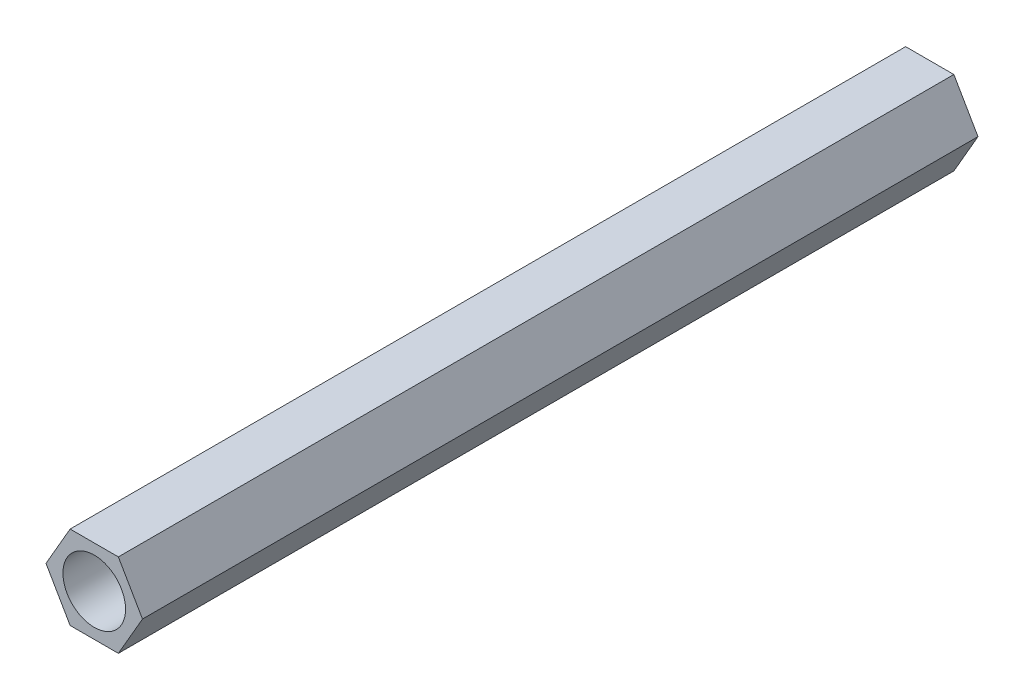
ISO-10303-21;
HEADER;
FILE_DESCRIPTION(('STEP AP214'),'2;1');
FILE_NAME('part.step','',(''),(''),'','','');
FILE_SCHEMA(('AUTOMOTIVE_DESIGN { 1 0 10303 214 1 1 1 1 }'));
ENDSEC;
DATA;
#1=APPLICATION_CONTEXT('core data for automotive mechanical design processes');
#2=APPLICATION_PROTOCOL_DEFINITION('international standard','automotive_design',2000,#1);
#3=PRODUCT_CONTEXT('',#1,'mechanical');
#4=PRODUCT('Part','Part','',(#3));
#5=PRODUCT_RELATED_PRODUCT_CATEGORY('part','',(#4));
#6=PRODUCT_DEFINITION_FORMATION('','',#4);
#7=PRODUCT_DEFINITION_CONTEXT('part definition',#1,'design');
#8=PRODUCT_DEFINITION('design','',#6,#7);
#9=PRODUCT_DEFINITION_SHAPE('','',#8);
#10=(LENGTH_UNIT() NAMED_UNIT(*) SI_UNIT(.MILLI.,.METRE.));
#11=(NAMED_UNIT(*) PLANE_ANGLE_UNIT() SI_UNIT($,.RADIAN.));
#12=(NAMED_UNIT(*) SI_UNIT($,.STERADIAN.) SOLID_ANGLE_UNIT());
#13=UNCERTAINTY_MEASURE_WITH_UNIT(LENGTH_MEASURE(1.E-05),#10,'distance_accuracy_value','');
#14=(GEOMETRIC_REPRESENTATION_CONTEXT(3) GLOBAL_UNCERTAINTY_ASSIGNED_CONTEXT((#13)) GLOBAL_UNIT_ASSIGNED_CONTEXT((#10,
#11,#12)) REPRESENTATION_CONTEXT('',''));
#15=CARTESIAN_POINT('',(0.,0.,0.));
#16=DIRECTION('',(0.,0.,1.));
#17=DIRECTION('',(1.,0.,0.));
#18=AXIS2_PLACEMENT_3D('',#15,#16,#17);
#19=CARTESIAN_POINT('',(0.,0.,40.));
#20=DIRECTION('',(0.,0.,1.));
#21=DIRECTION('',(1.,0.,0.));
#22=AXIS2_PLACEMENT_3D('',#19,#20,#21);
#23=PLANE('',#22);
#24=DIRECTION('',(0.5,0.866025403784439,0.));
#25=VECTOR('',#24,1.);
#26=CARTESIAN_POINT('',(1.15470053837925,-2.,40.));
#27=LINE('',#26,#25);
#28=CARTESIAN_POINT('',(1.15470053837925,-2.,40.));
#29=VERTEX_POINT('',#28);
#30=CARTESIAN_POINT('',(2.3094010767585,0.,40.));
#31=VERTEX_POINT('',#30);
#32=EDGE_CURVE('E150',#29,#31,#27,.T.);
#33=ORIENTED_EDGE('',*,*,#32,.T.);
#34=DIRECTION('',(-0.5,0.866025403784439,0.));
#35=VECTOR('',#34,1.);
#36=CARTESIAN_POINT('',(2.3094010767585,0.,40.));
#37=LINE('',#36,#35);
#38=CARTESIAN_POINT('',(1.15470053837925,2.,40.));
#39=VERTEX_POINT('',#38);
#40=EDGE_CURVE('E98',#31,#39,#37,.T.);
#41=ORIENTED_EDGE('',*,*,#40,.T.);
#42=DIRECTION('',(-1.,0.,0.));
#43=VECTOR('',#42,1.);
#44=CARTESIAN_POINT('',(1.15470053837925,2.,40.));
#45=LINE('',#44,#43);
#46=CARTESIAN_POINT('',(-1.15470053837925,2.,40.));
#47=VERTEX_POINT('',#46);
#48=EDGE_CURVE('E111',#39,#47,#45,.T.);
#49=ORIENTED_EDGE('',*,*,#48,.T.);
#50=DIRECTION('',(-0.5,-0.866025403784439,0.));
#51=VECTOR('',#50,1.);
#52=CARTESIAN_POINT('',(-1.15470053837925,2.,40.));
#53=LINE('',#52,#51);
#54=CARTESIAN_POINT('',(-2.3094010767585,0.,40.));
#55=VERTEX_POINT('',#54);
#56=EDGE_CURVE('E105',#47,#55,#53,.T.);
#57=ORIENTED_EDGE('',*,*,#56,.T.);
#58=DIRECTION('',(0.5,-0.866025403784438,0.));
#59=VECTOR('',#58,1.);
#60=CARTESIAN_POINT('',(-2.3094010767585,0.,40.));
#61=LINE('',#60,#59);
#62=CARTESIAN_POINT('',(-1.15470053837925,-2.,40.));
#63=VERTEX_POINT('',#62);
#64=EDGE_CURVE('E109',#55,#63,#61,.T.);
#65=ORIENTED_EDGE('',*,*,#64,.T.);
#66=DIRECTION('',(1.,0.,0.));
#67=VECTOR('',#66,1.);
#68=CARTESIAN_POINT('',(-1.15470053837925,-2.,40.));
#69=LINE('',#68,#67);
#70=EDGE_CURVE('E61',#63,#29,#69,.T.);
#71=ORIENTED_EDGE('',*,*,#70,.T.);
#72=EDGE_LOOP('',(#33,#41,#49,#57,#65,#71));
#73=FACE_BOUND('',#72,.T.);
#74=CARTESIAN_POINT('',(0.,0.,40.));
#75=DIRECTION('',(0.,0.,1.));
#76=DIRECTION('',(1.,0.,0.));
#77=AXIS2_PLACEMENT_3D('',#74,#75,#76);
#78=CIRCLE('',#77,1.5);
#79=CARTESIAN_POINT('',(1.5,0.,40.));
#80=VERTEX_POINT('',#79);
#81=EDGE_CURVE('E138',#80,#80,#78,.T.);
#82=ORIENTED_EDGE('',*,*,#81,.F.);
#83=EDGE_LOOP('',(#82));
#84=FACE_BOUND('',#83,.T.);
#85=ADVANCED_FACE('F43',(#73,#84),#23,.T.);
#86=CARTESIAN_POINT('',(0.,0.,0.));
#87=DIRECTION('',(0.,0.,1.));
#88=DIRECTION('',(1.,0.,0.));
#89=AXIS2_PLACEMENT_3D('',#86,#87,#88);
#90=PLANE('',#89);
#91=DIRECTION('',(0.5,0.866025403784439,0.));
#92=VECTOR('',#91,1.);
#93=CARTESIAN_POINT('',(1.15470053837925,-2.,0.));
#94=LINE('',#93,#92);
#95=CARTESIAN_POINT('',(1.15470053837925,-2.,0.));
#96=VERTEX_POINT('',#95);
#97=CARTESIAN_POINT('',(2.3094010767585,0.,0.));
#98=VERTEX_POINT('',#97);
#99=EDGE_CURVE('E133',#96,#98,#94,.T.);
#100=ORIENTED_EDGE('',*,*,#99,.F.);
#101=DIRECTION('',(1.,0.,0.));
#102=VECTOR('',#101,1.);
#103=CARTESIAN_POINT('',(-1.15470053837925,-2.,0.));
#104=LINE('',#103,#102);
#105=CARTESIAN_POINT('',(-1.15470053837925,-2.,0.));
#106=VERTEX_POINT('',#105);
#107=EDGE_CURVE('E90',#106,#96,#104,.T.);
#108=ORIENTED_EDGE('',*,*,#107,.F.);
#109=DIRECTION('',(0.5,-0.866025403784438,0.));
#110=VECTOR('',#109,1.);
#111=CARTESIAN_POINT('',(-2.3094010767585,0.,0.));
#112=LINE('',#111,#110);
#113=CARTESIAN_POINT('',(-2.3094010767585,0.,0.));
#114=VERTEX_POINT('',#113);
#115=EDGE_CURVE('E84',#114,#106,#112,.T.);
#116=ORIENTED_EDGE('',*,*,#115,.F.);
#117=DIRECTION('',(-0.5,-0.866025403784439,0.));
#118=VECTOR('',#117,1.);
#119=CARTESIAN_POINT('',(-1.15470053837925,2.,0.));
#120=LINE('',#119,#118);
#121=CARTESIAN_POINT('',(-1.15470053837925,2.,0.));
#122=VERTEX_POINT('',#121);
#123=EDGE_CURVE('E120',#122,#114,#120,.T.);
#124=ORIENTED_EDGE('',*,*,#123,.F.);
#125=DIRECTION('',(-1.,0.,0.));
#126=VECTOR('',#125,1.);
#127=CARTESIAN_POINT('',(1.15470053837925,2.,0.));
#128=LINE('',#127,#126);
#129=CARTESIAN_POINT('',(1.15470053837925,2.,0.));
#130=VERTEX_POINT('',#129);
#131=EDGE_CURVE('E141',#130,#122,#128,.T.);
#132=ORIENTED_EDGE('',*,*,#131,.F.);
#133=DIRECTION('',(-0.5,0.866025403784439,0.));
#134=VECTOR('',#133,1.);
#135=CARTESIAN_POINT('',(2.3094010767585,0.,0.));
#136=LINE('',#135,#134);
#137=EDGE_CURVE('E137',#98,#130,#136,.T.);
#138=ORIENTED_EDGE('',*,*,#137,.F.);
#139=EDGE_LOOP('',(#100,#108,#116,#124,#132,#138));
#140=FACE_BOUND('',#139,.T.);
#141=CARTESIAN_POINT('',(0.,0.,0.));
#142=DIRECTION('',(0.,0.,1.));
#143=DIRECTION('',(1.,0.,0.));
#144=AXIS2_PLACEMENT_3D('',#141,#142,#143);
#145=CIRCLE('',#144,1.5);
#146=CARTESIAN_POINT('',(1.5,0.,0.));
#147=VERTEX_POINT('',#146);
#148=EDGE_CURVE('E265',#147,#147,#145,.T.);
#149=ORIENTED_EDGE('',*,*,#148,.T.);
#150=EDGE_LOOP('',(#149));
#151=FACE_BOUND('',#150,.T.);
#152=ADVANCED_FACE('F163',(#140,#151),#90,.F.);
#153=CARTESIAN_POINT('',(1.15470053837925,-2.,40.));
#154=DIRECTION('',(-0.866025403784439,0.5,0.));
#155=DIRECTION('',(-0.5,-0.866025403784439,0.));
#156=AXIS2_PLACEMENT_3D('',#153,#154,#155);
#157=PLANE('',#156);
#158=ORIENTED_EDGE('',*,*,#99,.T.);
#159=DIRECTION('',(0.,0.,-1.));
#160=VECTOR('',#159,1.);
#161=CARTESIAN_POINT('',(2.3094010767585,0.,40.));
#162=LINE('',#161,#160);
#163=EDGE_CURVE('E11',#31,#98,#162,.T.);
#164=ORIENTED_EDGE('',*,*,#163,.F.);
#165=ORIENTED_EDGE('',*,*,#32,.F.);
#166=DIRECTION('',(0.,0.,-1.));
#167=VECTOR('',#166,1.);
#168=CARTESIAN_POINT('',(1.15470053837925,-2.,40.));
#169=LINE('',#168,#167);
#170=EDGE_CURVE('E129',#29,#96,#169,.T.);
#171=ORIENTED_EDGE('',*,*,#170,.T.);
#172=EDGE_LOOP('',(#158,#164,#165,#171));
#173=FACE_BOUND('',#172,.T.);
#174=ADVANCED_FACE('F45',(#173),#157,.F.);
#175=CARTESIAN_POINT('',(2.3094010767585,0.,40.));
#176=DIRECTION('',(-0.866025403784439,-0.5,0.));
#177=DIRECTION('',(0.5,-0.866025403784439,0.));
#178=AXIS2_PLACEMENT_3D('',#175,#176,#177);
#179=PLANE('',#178);
#180=ORIENTED_EDGE('',*,*,#137,.T.);
#181=DIRECTION('',(0.,0.,-1.));
#182=VECTOR('',#181,1.);
#183=CARTESIAN_POINT('',(1.15470053837925,2.,40.));
#184=LINE('',#183,#182);
#185=EDGE_CURVE('E53',#39,#130,#184,.T.);
#186=ORIENTED_EDGE('',*,*,#185,.F.);
#187=ORIENTED_EDGE('',*,*,#40,.F.);
#188=ORIENTED_EDGE('',*,*,#163,.T.);
#189=EDGE_LOOP('',(#180,#186,#187,#188));
#190=FACE_BOUND('',#189,.T.);
#191=ADVANCED_FACE('F188',(#190),#179,.F.);
#192=CARTESIAN_POINT('',(1.15470053837925,2.,40.));
#193=DIRECTION('',(0.,-1.,0.));
#194=DIRECTION('',(0.,0.,-1.));
#195=AXIS2_PLACEMENT_3D('',#192,#193,#194);
#196=PLANE('',#195);
#197=ORIENTED_EDGE('',*,*,#131,.T.);
#198=DIRECTION('',(0.,0.,-1.));
#199=VECTOR('',#198,1.);
#200=CARTESIAN_POINT('',(-1.15470053837925,2.,40.));
#201=LINE('',#200,#199);
#202=EDGE_CURVE('E122',#47,#122,#201,.T.);
#203=ORIENTED_EDGE('',*,*,#202,.F.);
#204=ORIENTED_EDGE('',*,*,#48,.F.);
#205=ORIENTED_EDGE('',*,*,#185,.T.);
#206=EDGE_LOOP('',(#197,#203,#204,#205));
#207=FACE_BOUND('',#206,.T.);
#208=ADVANCED_FACE('F160',(#207),#196,.F.);
#209=CARTESIAN_POINT('',(-1.15470053837925,2.,40.));
#210=DIRECTION('',(0.866025403784439,-0.5,0.));
#211=DIRECTION('',(0.5,0.866025403784439,0.));
#212=AXIS2_PLACEMENT_3D('',#209,#210,#211);
#213=PLANE('',#212);
#214=ORIENTED_EDGE('',*,*,#123,.T.);
#215=DIRECTION('',(0.,0.,-1.));
#216=VECTOR('',#215,1.);
#217=CARTESIAN_POINT('',(-2.3094010767585,0.,40.));
#218=LINE('',#217,#216);
#219=EDGE_CURVE('E117',#55,#114,#218,.T.);
#220=ORIENTED_EDGE('',*,*,#219,.F.);
#221=ORIENTED_EDGE('',*,*,#56,.F.);
#222=ORIENTED_EDGE('',*,*,#202,.T.);
#223=EDGE_LOOP('',(#214,#220,#221,#222));
#224=FACE_BOUND('',#223,.T.);
#225=ADVANCED_FACE('F118',(#224),#213,.F.);
#226=CARTESIAN_POINT('',(-2.3094010767585,0.,40.));
#227=DIRECTION('',(0.866025403784438,0.5,0.));
#228=DIRECTION('',(-0.5,0.866025403784438,0.));
#229=AXIS2_PLACEMENT_3D('',#226,#227,#228);
#230=PLANE('',#229);
#231=ORIENTED_EDGE('',*,*,#115,.T.);
#232=DIRECTION('',(0.,0.,-1.));
#233=VECTOR('',#232,1.);
#234=CARTESIAN_POINT('',(-1.15470053837925,-2.,40.));
#235=LINE('',#234,#233);
#236=EDGE_CURVE('E123',#63,#106,#235,.T.);
#237=ORIENTED_EDGE('',*,*,#236,.F.);
#238=ORIENTED_EDGE('',*,*,#64,.F.);
#239=ORIENTED_EDGE('',*,*,#219,.T.);
#240=EDGE_LOOP('',(#231,#237,#238,#239));
#241=FACE_BOUND('',#240,.T.);
#242=ADVANCED_FACE('F125',(#241),#230,.F.);
#243=CARTESIAN_POINT('',(-1.15470053837925,-2.,40.));
#244=DIRECTION('',(0.,1.,0.));
#245=DIRECTION('',(0.,0.,1.));
#246=AXIS2_PLACEMENT_3D('',#243,#244,#245);
#247=PLANE('',#246);
#248=ORIENTED_EDGE('',*,*,#107,.T.);
#249=ORIENTED_EDGE('',*,*,#170,.F.);
#250=ORIENTED_EDGE('',*,*,#70,.F.);
#251=ORIENTED_EDGE('',*,*,#236,.T.);
#252=EDGE_LOOP('',(#248,#249,#250,#251));
#253=FACE_BOUND('',#252,.T.);
#254=ADVANCED_FACE('F168',(#253),#247,.F.);
#255=CARTESIAN_POINT('',(0.,0.,40.));
#256=DIRECTION('',(0.,0.,-1.));
#257=DIRECTION('',(-1.,0.,0.));
#258=AXIS2_PLACEMENT_3D('',#255,#256,#257);
#259=CYLINDRICAL_SURFACE('',#258,1.5);
#260=ORIENTED_EDGE('',*,*,#81,.T.);
#261=EDGE_LOOP('',(#260));
#262=FACE_BOUND('',#261,.T.);
#263=ORIENTED_EDGE('',*,*,#148,.F.);
#264=EDGE_LOOP('',(#263));
#265=FACE_BOUND('',#264,.T.);
#266=ADVANCED_FACE('F170',(#262,#265),#259,.F.);
#267=CLOSED_SHELL('',(#85,#152,#174,#191,#208,#225,#242,#254,#266));
#268=MANIFOLD_SOLID_BREP('B2',#267);
#269=ADVANCED_BREP_SHAPE_REPRESENTATION('',(#18,#268),#14);
#270=SHAPE_DEFINITION_REPRESENTATION(#9,#269);
ENDSEC;
END-ISO-10303-21;
